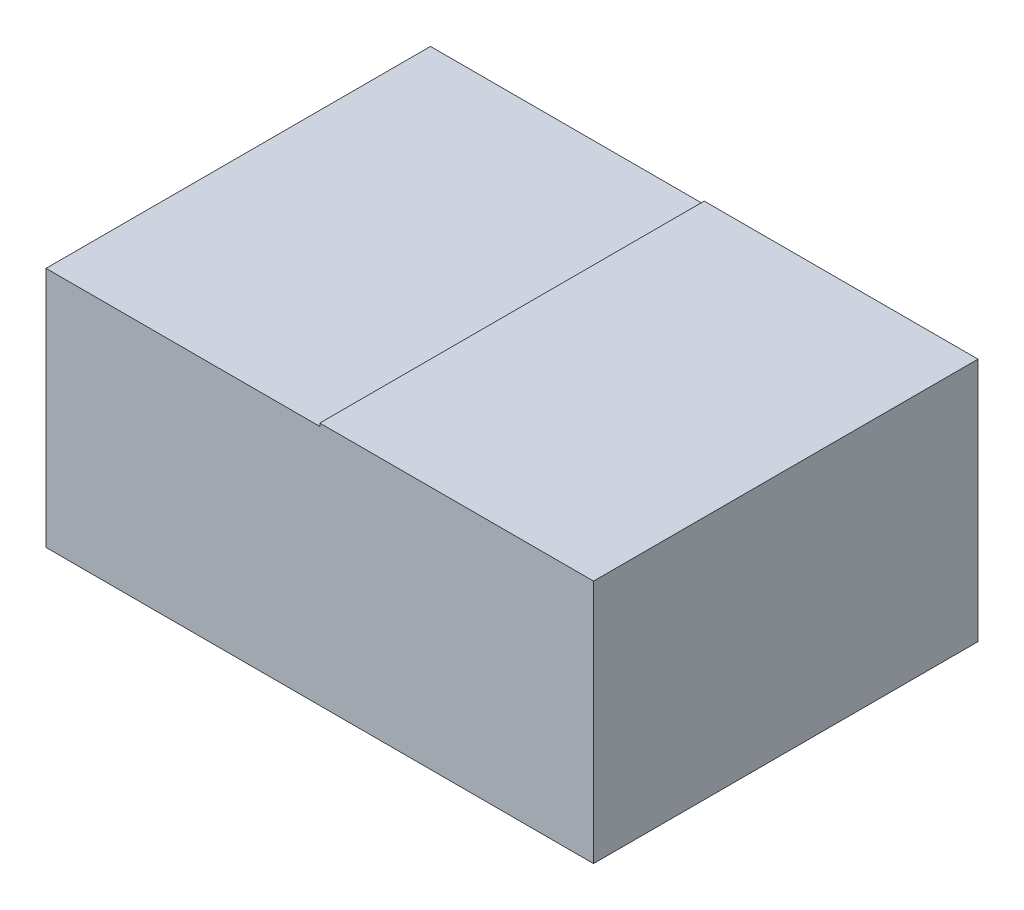
ISO-10303-21;
HEADER;
FILE_DESCRIPTION(('STEP AP214'),'2;1');
FILE_NAME('part.step','',(''),(''),'','','');
FILE_SCHEMA(('AUTOMOTIVE_DESIGN { 1 0 10303 214 1 1 1 1 }'));
ENDSEC;
DATA;
#1=APPLICATION_CONTEXT('core data for automotive mechanical design processes');
#2=APPLICATION_PROTOCOL_DEFINITION('international standard','automotive_design',2000,#1);
#3=PRODUCT_CONTEXT('',#1,'mechanical');
#4=PRODUCT('Part','Part','',(#3));
#5=PRODUCT_RELATED_PRODUCT_CATEGORY('part','',(#4));
#6=PRODUCT_DEFINITION_FORMATION('','',#4);
#7=PRODUCT_DEFINITION_CONTEXT('part definition',#1,'design');
#8=PRODUCT_DEFINITION('design','',#6,#7);
#9=PRODUCT_DEFINITION_SHAPE('','',#8);
#10=(LENGTH_UNIT() NAMED_UNIT(*) SI_UNIT(.MILLI.,.METRE.));
#11=(NAMED_UNIT(*) PLANE_ANGLE_UNIT() SI_UNIT($,.RADIAN.));
#12=(NAMED_UNIT(*) SI_UNIT($,.STERADIAN.) SOLID_ANGLE_UNIT());
#13=UNCERTAINTY_MEASURE_WITH_UNIT(LENGTH_MEASURE(1.E-05),#10,'distance_accuracy_value','');
#14=(GEOMETRIC_REPRESENTATION_CONTEXT(3) GLOBAL_UNCERTAINTY_ASSIGNED_CONTEXT((#13)) GLOBAL_UNIT_ASSIGNED_CONTEXT((#10,
#11,#12)) REPRESENTATION_CONTEXT('',''));
#15=CARTESIAN_POINT('',(0.,0.,0.));
#16=DIRECTION('',(0.,0.,1.));
#17=DIRECTION('',(1.,0.,0.));
#18=AXIS2_PLACEMENT_3D('',#15,#16,#17);
#19=CARTESIAN_POINT('',(0.,8.4,0.));
#20=DIRECTION('',(1.,0.,0.));
#21=DIRECTION('',(0.,0.,-1.));
#22=AXIS2_PLACEMENT_3D('',#19,#20,#21);
#23=PLANE('',#22);
#24=DIRECTION('',(0.,0.,1.));
#25=VECTOR('',#24,1.);
#26=CARTESIAN_POINT('',(0.,8.3,-13.2));
#27=LINE('',#26,#25);
#28=CARTESIAN_POINT('',(0.,8.3,-13.2));
#29=VERTEX_POINT('',#28);
#30=CARTESIAN_POINT('',(0.,8.3,0.));
#31=VERTEX_POINT('',#30);
#32=EDGE_CURVE('E95',#29,#31,#27,.T.);
#33=ORIENTED_EDGE('',*,*,#32,.F.);
#34=DIRECTION('',(0.,-1.,0.));
#35=VECTOR('',#34,1.);
#36=CARTESIAN_POINT('',(0.,8.4,-13.2));
#37=LINE('',#36,#35);
#38=CARTESIAN_POINT('',(0.,0.,-13.2));
#39=VERTEX_POINT('',#38);
#40=EDGE_CURVE('E89',#29,#39,#37,.T.);
#41=ORIENTED_EDGE('',*,*,#40,.T.);
#42=DIRECTION('',(0.,0.,1.));
#43=VECTOR('',#42,1.);
#44=CARTESIAN_POINT('',(0.,0.,0.));
#45=LINE('',#44,#43);
#46=CARTESIAN_POINT('',(0.,0.,0.));
#47=VERTEX_POINT('',#46);
#48=EDGE_CURVE('E93',#39,#47,#45,.T.);
#49=ORIENTED_EDGE('',*,*,#48,.T.);
#50=DIRECTION('',(0.,-1.,0.));
#51=VECTOR('',#50,1.);
#52=CARTESIAN_POINT('',(0.,8.4,0.));
#53=LINE('',#52,#51);
#54=EDGE_CURVE('E12',#31,#47,#53,.T.);
#55=ORIENTED_EDGE('',*,*,#54,.F.);
#56=EDGE_LOOP('',(#33,#41,#49,#55));
#57=FACE_BOUND('',#56,.T.);
#58=ADVANCED_FACE('F46',(#57),#23,.F.);
#59=CARTESIAN_POINT('',(0.,8.4,0.));
#60=DIRECTION('',(0.,0.,-1.));
#61=DIRECTION('',(-1.,0.,0.));
#62=AXIS2_PLACEMENT_3D('',#59,#60,#61);
#63=PLANE('',#62);
#64=DIRECTION('',(1.,0.,0.));
#65=VECTOR('',#64,1.);
#66=CARTESIAN_POINT('',(0.,8.4,0.));
#67=LINE('',#66,#65);
#68=CARTESIAN_POINT('',(9.4,8.4,0.));
#69=VERTEX_POINT('',#68);
#70=CARTESIAN_POINT('',(18.8,8.4,0.));
#71=VERTEX_POINT('',#70);
#72=EDGE_CURVE('E110',#69,#71,#67,.T.);
#73=ORIENTED_EDGE('',*,*,#72,.F.);
#74=DIRECTION('',(0.,1.,0.));
#75=VECTOR('',#74,1.);
#76=CARTESIAN_POINT('',(9.4,8.3,0.));
#77=LINE('',#76,#75);
#78=CARTESIAN_POINT('',(9.4,8.3,0.));
#79=VERTEX_POINT('',#78);
#80=EDGE_CURVE('E61',#79,#69,#77,.T.);
#81=ORIENTED_EDGE('',*,*,#80,.F.);
#82=DIRECTION('',(1.,0.,0.));
#83=VECTOR('',#82,1.);
#84=CARTESIAN_POINT('',(0.,8.3,0.));
#85=LINE('',#84,#83);
#86=EDGE_CURVE('E141',#31,#79,#85,.T.);
#87=ORIENTED_EDGE('',*,*,#86,.F.);
#88=ORIENTED_EDGE('',*,*,#54,.T.);
#89=DIRECTION('',(1.,0.,0.));
#90=VECTOR('',#89,1.);
#91=CARTESIAN_POINT('',(0.,0.,0.));
#92=LINE('',#91,#90);
#93=CARTESIAN_POINT('',(18.8,0.,0.));
#94=VERTEX_POINT('',#93);
#95=EDGE_CURVE('E115',#47,#94,#92,.T.);
#96=ORIENTED_EDGE('',*,*,#95,.T.);
#97=DIRECTION('',(0.,-1.,0.));
#98=VECTOR('',#97,1.);
#99=CARTESIAN_POINT('',(18.8,8.4,0.));
#100=LINE('',#99,#98);
#101=EDGE_CURVE('E54',#71,#94,#100,.T.);
#102=ORIENTED_EDGE('',*,*,#101,.F.);
#103=EDGE_LOOP('',(#73,#81,#87,#88,#96,#102));
#104=FACE_BOUND('',#103,.T.);
#105=ADVANCED_FACE('F137',(#104),#63,.F.);
#106=CARTESIAN_POINT('',(18.8,8.4,0.));
#107=DIRECTION('',(-1.,0.,0.));
#108=DIRECTION('',(0.,0.,1.));
#109=AXIS2_PLACEMENT_3D('',#106,#107,#108);
#110=PLANE('',#109);
#111=DIRECTION('',(0.,0.,-1.));
#112=VECTOR('',#111,1.);
#113=CARTESIAN_POINT('',(18.8,0.,0.));
#114=LINE('',#113,#112);
#115=CARTESIAN_POINT('',(18.8,0.,-13.2));
#116=VERTEX_POINT('',#115);
#117=EDGE_CURVE('E111',#94,#116,#114,.T.);
#118=ORIENTED_EDGE('',*,*,#117,.T.);
#119=DIRECTION('',(0.,-1.,0.));
#120=VECTOR('',#119,1.);
#121=CARTESIAN_POINT('',(18.8,8.4,-13.2));
#122=LINE('',#121,#120);
#123=CARTESIAN_POINT('',(18.8,8.4,-13.2));
#124=VERTEX_POINT('',#123);
#125=EDGE_CURVE('E99',#124,#116,#122,.T.);
#126=ORIENTED_EDGE('',*,*,#125,.F.);
#127=DIRECTION('',(0.,0.,-1.));
#128=VECTOR('',#127,1.);
#129=CARTESIAN_POINT('',(18.8,8.4,0.));
#130=LINE('',#129,#128);
#131=EDGE_CURVE('E70',#71,#124,#130,.T.);
#132=ORIENTED_EDGE('',*,*,#131,.F.);
#133=ORIENTED_EDGE('',*,*,#101,.T.);
#134=EDGE_LOOP('',(#118,#126,#132,#133));
#135=FACE_BOUND('',#134,.T.);
#136=ADVANCED_FACE('F134',(#135),#110,.F.);
#137=CARTESIAN_POINT('',(0.,8.4,-13.2));
#138=DIRECTION('',(0.,0.,1.));
#139=DIRECTION('',(1.,0.,0.));
#140=AXIS2_PLACEMENT_3D('',#137,#138,#139);
#141=PLANE('',#140);
#142=DIRECTION('',(-1.,0.,0.));
#143=VECTOR('',#142,1.);
#144=CARTESIAN_POINT('',(0.,8.3,-13.2));
#145=LINE('',#144,#143);
#146=CARTESIAN_POINT('',(9.4,8.3,-13.2));
#147=VERTEX_POINT('',#146);
#148=EDGE_CURVE('E153',#147,#29,#145,.T.);
#149=ORIENTED_EDGE('',*,*,#148,.F.);
#150=DIRECTION('',(0.,1.,0.));
#151=VECTOR('',#150,1.);
#152=CARTESIAN_POINT('',(9.4,8.3,-13.2));
#153=LINE('',#152,#151);
#154=CARTESIAN_POINT('',(9.4,8.4,-13.2));
#155=VERTEX_POINT('',#154);
#156=EDGE_CURVE('E117',#147,#155,#153,.T.);
#157=ORIENTED_EDGE('',*,*,#156,.T.);
#158=DIRECTION('',(-1.,0.,0.));
#159=VECTOR('',#158,1.);
#160=CARTESIAN_POINT('',(0.,8.4,-13.2));
#161=LINE('',#160,#159);
#162=EDGE_CURVE('E100',#124,#155,#161,.T.);
#163=ORIENTED_EDGE('',*,*,#162,.F.);
#164=ORIENTED_EDGE('',*,*,#125,.T.);
#165=DIRECTION('',(-1.,0.,0.));
#166=VECTOR('',#165,1.);
#167=CARTESIAN_POINT('',(0.,0.,-13.2));
#168=LINE('',#167,#166);
#169=EDGE_CURVE('E104',#116,#39,#168,.T.);
#170=ORIENTED_EDGE('',*,*,#169,.T.);
#171=ORIENTED_EDGE('',*,*,#40,.F.);
#172=EDGE_LOOP('',(#149,#157,#163,#164,#170,#171));
#173=FACE_BOUND('',#172,.T.);
#174=ADVANCED_FACE('F105',(#173),#141,.F.);
#175=CARTESIAN_POINT('',(0.,8.4,0.));
#176=DIRECTION('',(0.,-1.,0.));
#177=DIRECTION('',(0.,0.,-1.));
#178=AXIS2_PLACEMENT_3D('',#175,#176,#177);
#179=PLANE('',#178);
#180=ORIENTED_EDGE('',*,*,#162,.T.);
#181=DIRECTION('',(0.,0.,-1.));
#182=VECTOR('',#181,1.);
#183=CARTESIAN_POINT('',(9.4,8.4,-13.2));
#184=LINE('',#183,#182);
#185=EDGE_CURVE('E164',#69,#155,#184,.T.);
#186=ORIENTED_EDGE('',*,*,#185,.F.);
#187=ORIENTED_EDGE('',*,*,#72,.T.);
#188=ORIENTED_EDGE('',*,*,#131,.T.);
#189=EDGE_LOOP('',(#180,#186,#187,#188));
#190=FACE_BOUND('',#189,.T.);
#191=ADVANCED_FACE('F170',(#190),#179,.F.);
#192=CARTESIAN_POINT('',(0.,0.,0.));
#193=DIRECTION('',(0.,-1.,0.));
#194=DIRECTION('',(0.,0.,-1.));
#195=AXIS2_PLACEMENT_3D('',#192,#193,#194);
#196=PLANE('',#195);
#197=ORIENTED_EDGE('',*,*,#48,.F.);
#198=ORIENTED_EDGE('',*,*,#169,.F.);
#199=ORIENTED_EDGE('',*,*,#117,.F.);
#200=ORIENTED_EDGE('',*,*,#95,.F.);
#201=EDGE_LOOP('',(#197,#198,#199,#200));
#202=FACE_BOUND('',#201,.T.);
#203=ADVANCED_FACE('F114',(#202),#196,.T.);
#204=CARTESIAN_POINT('',(9.4,8.3,-13.2));
#205=DIRECTION('',(1.,0.,0.));
#206=DIRECTION('',(0.,0.,-1.));
#207=AXIS2_PLACEMENT_3D('',#204,#205,#206);
#208=PLANE('',#207);
#209=ORIENTED_EDGE('',*,*,#185,.T.);
#210=ORIENTED_EDGE('',*,*,#156,.F.);
#211=DIRECTION('',(0.,0.,-1.));
#212=VECTOR('',#211,1.);
#213=CARTESIAN_POINT('',(9.4,8.3,-13.2));
#214=LINE('',#213,#212);
#215=EDGE_CURVE('E155',#79,#147,#214,.T.);
#216=ORIENTED_EDGE('',*,*,#215,.F.);
#217=ORIENTED_EDGE('',*,*,#80,.T.);
#218=EDGE_LOOP('',(#209,#210,#216,#217));
#219=FACE_BOUND('',#218,.T.);
#220=ADVANCED_FACE('F171',(#219),#208,.F.);
#221=CARTESIAN_POINT('',(0.,8.3,0.));
#222=DIRECTION('',(0.,1.,0.));
#223=DIRECTION('',(0.,0.,1.));
#224=AXIS2_PLACEMENT_3D('',#221,#222,#223);
#225=PLANE('',#224);
#226=ORIENTED_EDGE('',*,*,#32,.T.);
#227=ORIENTED_EDGE('',*,*,#86,.T.);
#228=ORIENTED_EDGE('',*,*,#215,.T.);
#229=ORIENTED_EDGE('',*,*,#148,.T.);
#230=EDGE_LOOP('',(#226,#227,#228,#229));
#231=FACE_BOUND('',#230,.T.);
#232=ADVANCED_FACE('F154',(#231),#225,.T.);
#233=CLOSED_SHELL('',(#58,#105,#136,#174,#191,#203,#220,#232));
#234=MANIFOLD_SOLID_BREP('B2',#233);
#235=ADVANCED_BREP_SHAPE_REPRESENTATION('',(#18,#234),#14);
#236=SHAPE_DEFINITION_REPRESENTATION(#9,#235);
ENDSEC;
END-ISO-10303-21;
